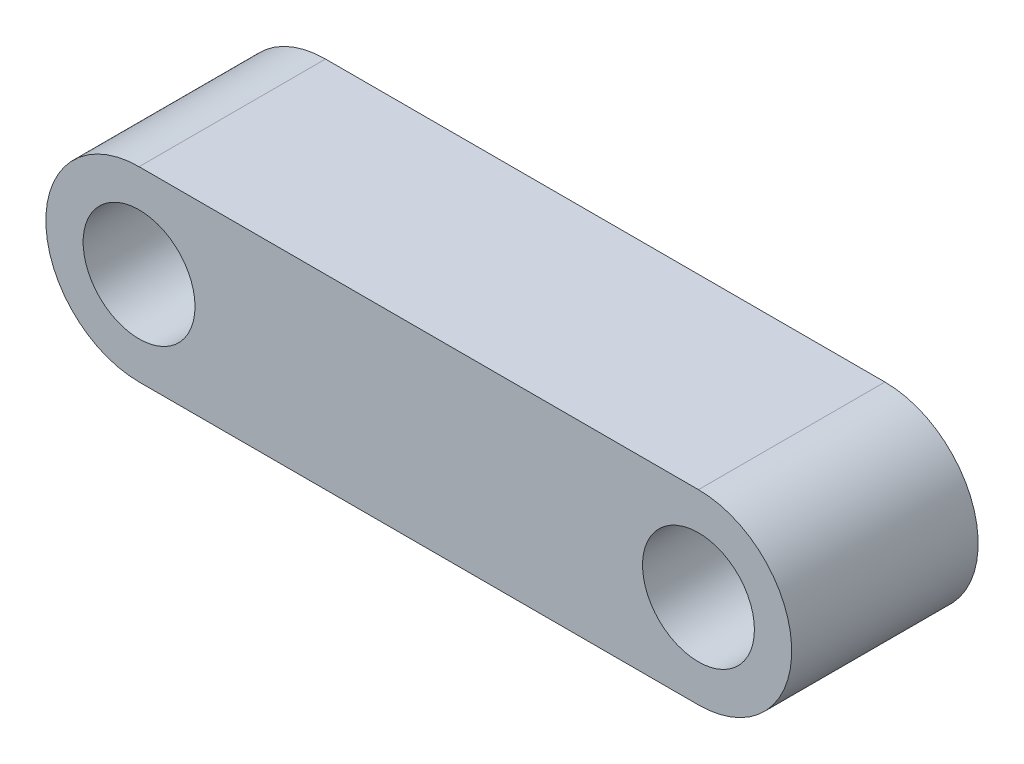
ISO-10303-21;
HEADER;
FILE_DESCRIPTION(('STEP AP214'),'2;1');
FILE_NAME('part.step','',(''),(''),'','','');
FILE_SCHEMA(('AUTOMOTIVE_DESIGN { 1 0 10303 214 1 1 1 1 }'));
ENDSEC;
DATA;
#1=APPLICATION_CONTEXT('core data for automotive mechanical design processes');
#2=APPLICATION_PROTOCOL_DEFINITION('international standard','automotive_design',2000,#1);
#3=PRODUCT_CONTEXT('',#1,'mechanical');
#4=PRODUCT('Part','Part','',(#3));
#5=PRODUCT_RELATED_PRODUCT_CATEGORY('part','',(#4));
#6=PRODUCT_DEFINITION_FORMATION('','',#4);
#7=PRODUCT_DEFINITION_CONTEXT('part definition',#1,'design');
#8=PRODUCT_DEFINITION('design','',#6,#7);
#9=PRODUCT_DEFINITION_SHAPE('','',#8);
#10=(LENGTH_UNIT() NAMED_UNIT(*) SI_UNIT(.MILLI.,.METRE.));
#11=(NAMED_UNIT(*) PLANE_ANGLE_UNIT() SI_UNIT($,.RADIAN.));
#12=(NAMED_UNIT(*) SI_UNIT($,.STERADIAN.) SOLID_ANGLE_UNIT());
#13=UNCERTAINTY_MEASURE_WITH_UNIT(LENGTH_MEASURE(1.E-05),#10,'distance_accuracy_value','');
#14=(GEOMETRIC_REPRESENTATION_CONTEXT(3) GLOBAL_UNCERTAINTY_ASSIGNED_CONTEXT((#13)) GLOBAL_UNIT_ASSIGNED_CONTEXT((#10,
#11,#12)) REPRESENTATION_CONTEXT('',''));
#15=CARTESIAN_POINT('',(0.,0.,0.));
#16=DIRECTION('',(0.,0.,1.));
#17=DIRECTION('',(1.,0.,0.));
#18=AXIS2_PLACEMENT_3D('',#15,#16,#17);
#19=CARTESIAN_POINT('',(-30.,0.,20.));
#20=DIRECTION('',(0.,0.,-1.));
#21=DIRECTION('',(-1.,0.,0.));
#22=AXIS2_PLACEMENT_3D('',#19,#20,#21);
#23=CYLINDRICAL_SURFACE('',#22,10.);
#24=CARTESIAN_POINT('',(-30.,0.,0.));
#25=DIRECTION('',(0.,0.,1.));
#26=DIRECTION('',(1.,0.,0.));
#27=AXIS2_PLACEMENT_3D('',#24,#25,#26);
#28=CIRCLE('',#27,10.);
#29=CARTESIAN_POINT('',(-30.,9.99999999999999,0.));
#30=VERTEX_POINT('',#29);
#31=CARTESIAN_POINT('',(-30.,-10.,0.));
#32=VERTEX_POINT('',#31);
#33=EDGE_CURVE('E99',#30,#32,#28,.T.);
#34=ORIENTED_EDGE('',*,*,#33,.T.);
#35=DIRECTION('',(0.,0.,-1.));
#36=VECTOR('',#35,1.);
#37=CARTESIAN_POINT('',(-30.,-10.,20.));
#38=LINE('',#37,#36);
#39=CARTESIAN_POINT('',(-30.,-10.,20.));
#40=VERTEX_POINT('',#39);
#41=EDGE_CURVE('E11',#40,#32,#38,.T.);
#42=ORIENTED_EDGE('',*,*,#41,.F.);
#43=CARTESIAN_POINT('',(-30.,0.,20.));
#44=DIRECTION('',(0.,0.,1.));
#45=DIRECTION('',(1.,0.,0.));
#46=AXIS2_PLACEMENT_3D('',#43,#44,#45);
#47=CIRCLE('',#46,10.);
#48=CARTESIAN_POINT('',(-30.,9.99999999999999,20.));
#49=VERTEX_POINT('',#48);
#50=EDGE_CURVE('E87',#49,#40,#47,.T.);
#51=ORIENTED_EDGE('',*,*,#50,.F.);
#52=DIRECTION('',(0.,0.,-1.));
#53=VECTOR('',#52,1.);
#54=CARTESIAN_POINT('',(-30.,9.99999999999999,20.));
#55=LINE('',#54,#53);
#56=EDGE_CURVE('E95',#49,#30,#55,.T.);
#57=ORIENTED_EDGE('',*,*,#56,.T.);
#58=EDGE_LOOP('',(#34,#42,#51,#57));
#59=FACE_BOUND('',#58,.T.);
#60=ADVANCED_FACE('F36',(#59),#23,.T.);
#61=CARTESIAN_POINT('',(30.,-10.,20.));
#62=DIRECTION('',(0.,1.,0.));
#63=DIRECTION('',(-1.,0.,0.));
#64=AXIS2_PLACEMENT_3D('',#61,#62,#63);
#65=PLANE('',#64);
#66=DIRECTION('',(1.,0.,0.));
#67=VECTOR('',#66,1.);
#68=CARTESIAN_POINT('',(30.,-10.,0.));
#69=LINE('',#68,#67);
#70=CARTESIAN_POINT('',(30.,-10.,0.));
#71=VERTEX_POINT('',#70);
#72=EDGE_CURVE('E91',#32,#71,#69,.T.);
#73=ORIENTED_EDGE('',*,*,#72,.T.);
#74=DIRECTION('',(0.,0.,-1.));
#75=VECTOR('',#74,1.);
#76=CARTESIAN_POINT('',(30.,-10.,20.));
#77=LINE('',#76,#75);
#78=CARTESIAN_POINT('',(30.,-10.,20.));
#79=VERTEX_POINT('',#78);
#80=EDGE_CURVE('E44',#79,#71,#77,.T.);
#81=ORIENTED_EDGE('',*,*,#80,.F.);
#82=DIRECTION('',(1.,0.,0.));
#83=VECTOR('',#82,1.);
#84=CARTESIAN_POINT('',(30.,-10.,20.));
#85=LINE('',#84,#83);
#86=EDGE_CURVE('E82',#40,#79,#85,.T.);
#87=ORIENTED_EDGE('',*,*,#86,.F.);
#88=ORIENTED_EDGE('',*,*,#41,.T.);
#89=EDGE_LOOP('',(#73,#81,#87,#88));
#90=FACE_BOUND('',#89,.T.);
#91=ADVANCED_FACE('F90',(#90),#65,.F.);
#92=CARTESIAN_POINT('',(30.,0.,20.));
#93=DIRECTION('',(0.,0.,-1.));
#94=DIRECTION('',(-1.,0.,0.));
#95=AXIS2_PLACEMENT_3D('',#92,#93,#94);
#96=CYLINDRICAL_SURFACE('',#95,10.);
#97=CARTESIAN_POINT('',(30.,0.,0.));
#98=DIRECTION('',(0.,0.,1.));
#99=DIRECTION('',(-1.,0.,0.));
#100=AXIS2_PLACEMENT_3D('',#97,#98,#99);
#101=CIRCLE('',#100,10.);
#102=CARTESIAN_POINT('',(30.,10.,0.));
#103=VERTEX_POINT('',#102);
#104=EDGE_CURVE('E69',#71,#103,#101,.T.);
#105=ORIENTED_EDGE('',*,*,#104,.T.);
#106=DIRECTION('',(0.,0.,-1.));
#107=VECTOR('',#106,1.);
#108=CARTESIAN_POINT('',(30.,10.,20.));
#109=LINE('',#108,#107);
#110=CARTESIAN_POINT('',(30.,10.,20.));
#111=VERTEX_POINT('',#110);
#112=EDGE_CURVE('E92',#111,#103,#109,.T.);
#113=ORIENTED_EDGE('',*,*,#112,.F.);
#114=CARTESIAN_POINT('',(30.,0.,20.));
#115=DIRECTION('',(0.,0.,1.));
#116=DIRECTION('',(-1.,0.,0.));
#117=AXIS2_PLACEMENT_3D('',#114,#115,#116);
#118=CIRCLE('',#117,10.);
#119=EDGE_CURVE('E85',#79,#111,#118,.T.);
#120=ORIENTED_EDGE('',*,*,#119,.F.);
#121=ORIENTED_EDGE('',*,*,#80,.T.);
#122=EDGE_LOOP('',(#105,#113,#120,#121));
#123=FACE_BOUND('',#122,.T.);
#124=ADVANCED_FACE('F93',(#123),#96,.T.);
#125=CARTESIAN_POINT('',(30.,10.,20.));
#126=DIRECTION('',(0.,-1.,0.));
#127=DIRECTION('',(1.,0.,0.));
#128=AXIS2_PLACEMENT_3D('',#125,#126,#127);
#129=PLANE('',#128);
#130=DIRECTION('',(-1.,0.,0.));
#131=VECTOR('',#130,1.);
#132=CARTESIAN_POINT('',(30.,10.,0.));
#133=LINE('',#132,#131);
#134=EDGE_CURVE('E75',#103,#30,#133,.T.);
#135=ORIENTED_EDGE('',*,*,#134,.T.);
#136=ORIENTED_EDGE('',*,*,#56,.F.);
#137=DIRECTION('',(-1.,0.,0.));
#138=VECTOR('',#137,1.);
#139=CARTESIAN_POINT('',(30.,10.,20.));
#140=LINE('',#139,#138);
#141=EDGE_CURVE('E52',#111,#49,#140,.T.);
#142=ORIENTED_EDGE('',*,*,#141,.F.);
#143=ORIENTED_EDGE('',*,*,#112,.T.);
#144=EDGE_LOOP('',(#135,#136,#142,#143));
#145=FACE_BOUND('',#144,.T.);
#146=ADVANCED_FACE('F107',(#145),#129,.F.);
#147=CARTESIAN_POINT('',(-30.,0.,20.));
#148=DIRECTION('',(0.,0.,1.));
#149=DIRECTION('',(1.,0.,0.));
#150=AXIS2_PLACEMENT_3D('',#147,#148,#149);
#151=PLANE('',#150);
#152=CARTESIAN_POINT('',(-30.,0.,20.));
#153=DIRECTION('',(0.,0.,1.));
#154=DIRECTION('',(1.,0.,0.));
#155=AXIS2_PLACEMENT_3D('',#152,#153,#154);
#156=CIRCLE('',#155,6.);
#157=CARTESIAN_POINT('',(-24.,0.,20.));
#158=VERTEX_POINT('',#157);
#159=EDGE_CURVE('E119',#158,#158,#156,.T.);
#160=ORIENTED_EDGE('',*,*,#159,.F.);
#161=EDGE_LOOP('',(#160));
#162=FACE_BOUND('',#161,.T.);
#163=CARTESIAN_POINT('',(30.,0.,20.));
#164=DIRECTION('',(0.,0.,1.));
#165=DIRECTION('',(1.,0.,0.));
#166=AXIS2_PLACEMENT_3D('',#163,#164,#165);
#167=CIRCLE('',#166,6.);
#168=CARTESIAN_POINT('',(36.,0.,20.));
#169=VERTEX_POINT('',#168);
#170=EDGE_CURVE('E113',#169,#169,#167,.T.);
#171=ORIENTED_EDGE('',*,*,#170,.F.);
#172=EDGE_LOOP('',(#171));
#173=FACE_BOUND('',#172,.T.);
#174=ORIENTED_EDGE('',*,*,#50,.T.);
#175=ORIENTED_EDGE('',*,*,#86,.T.);
#176=ORIENTED_EDGE('',*,*,#119,.T.);
#177=ORIENTED_EDGE('',*,*,#141,.T.);
#178=EDGE_LOOP('',(#174,#175,#176,#177));
#179=FACE_BOUND('',#178,.T.);
#180=ADVANCED_FACE('F83',(#162,#173,#179),#151,.T.);
#181=CARTESIAN_POINT('',(-30.,0.,0.));
#182=DIRECTION('',(0.,0.,1.));
#183=DIRECTION('',(1.,0.,0.));
#184=AXIS2_PLACEMENT_3D('',#181,#182,#183);
#185=PLANE('',#184);
#186=CARTESIAN_POINT('',(-30.,0.,0.));
#187=DIRECTION('',(0.,0.,1.));
#188=DIRECTION('',(1.,0.,0.));
#189=AXIS2_PLACEMENT_3D('',#186,#187,#188);
#190=CIRCLE('',#189,6.);
#191=CARTESIAN_POINT('',(-24.,0.,0.));
#192=VERTEX_POINT('',#191);
#193=EDGE_CURVE('E102',#192,#192,#190,.T.);
#194=ORIENTED_EDGE('',*,*,#193,.T.);
#195=EDGE_LOOP('',(#194));
#196=FACE_BOUND('',#195,.T.);
#197=CARTESIAN_POINT('',(30.,0.,0.));
#198=DIRECTION('',(0.,0.,1.));
#199=DIRECTION('',(1.,0.,0.));
#200=AXIS2_PLACEMENT_3D('',#197,#198,#199);
#201=CIRCLE('',#200,6.);
#202=CARTESIAN_POINT('',(36.,0.,0.));
#203=VERTEX_POINT('',#202);
#204=EDGE_CURVE('E116',#203,#203,#201,.T.);
#205=ORIENTED_EDGE('',*,*,#204,.T.);
#206=EDGE_LOOP('',(#205));
#207=FACE_BOUND('',#206,.T.);
#208=ORIENTED_EDGE('',*,*,#33,.F.);
#209=ORIENTED_EDGE('',*,*,#134,.F.);
#210=ORIENTED_EDGE('',*,*,#104,.F.);
#211=ORIENTED_EDGE('',*,*,#72,.F.);
#212=EDGE_LOOP('',(#208,#209,#210,#211));
#213=FACE_BOUND('',#212,.T.);
#214=ADVANCED_FACE('F110',(#196,#207,#213),#185,.F.);
#215=CARTESIAN_POINT('',(30.,0.,0.));
#216=DIRECTION('',(0.,0.,1.));
#217=DIRECTION('',(1.,0.,0.));
#218=AXIS2_PLACEMENT_3D('',#215,#216,#217);
#219=CYLINDRICAL_SURFACE('',#218,6.);
#220=ORIENTED_EDGE('',*,*,#204,.F.);
#221=EDGE_LOOP('',(#220));
#222=FACE_BOUND('',#221,.T.);
#223=ORIENTED_EDGE('',*,*,#170,.T.);
#224=EDGE_LOOP('',(#223));
#225=FACE_BOUND('',#224,.T.);
#226=ADVANCED_FACE('F130',(#222,#225),#219,.F.);
#227=CARTESIAN_POINT('',(-30.,0.,0.));
#228=DIRECTION('',(0.,0.,1.));
#229=DIRECTION('',(1.,0.,0.));
#230=AXIS2_PLACEMENT_3D('',#227,#228,#229);
#231=CYLINDRICAL_SURFACE('',#230,6.);
#232=ORIENTED_EDGE('',*,*,#193,.F.);
#233=EDGE_LOOP('',(#232));
#234=FACE_BOUND('',#233,.T.);
#235=ORIENTED_EDGE('',*,*,#159,.T.);
#236=EDGE_LOOP('',(#235));
#237=FACE_BOUND('',#236,.T.);
#238=ADVANCED_FACE('F127',(#234,#237),#231,.F.);
#239=CLOSED_SHELL('',(#60,#91,#124,#146,#180,#214,#226,#238));
#240=MANIFOLD_SOLID_BREP('B2',#239);
#241=ADVANCED_BREP_SHAPE_REPRESENTATION('',(#18,#240),#14);
#242=SHAPE_DEFINITION_REPRESENTATION(#9,#241);
ENDSEC;
END-ISO-10303-21;
